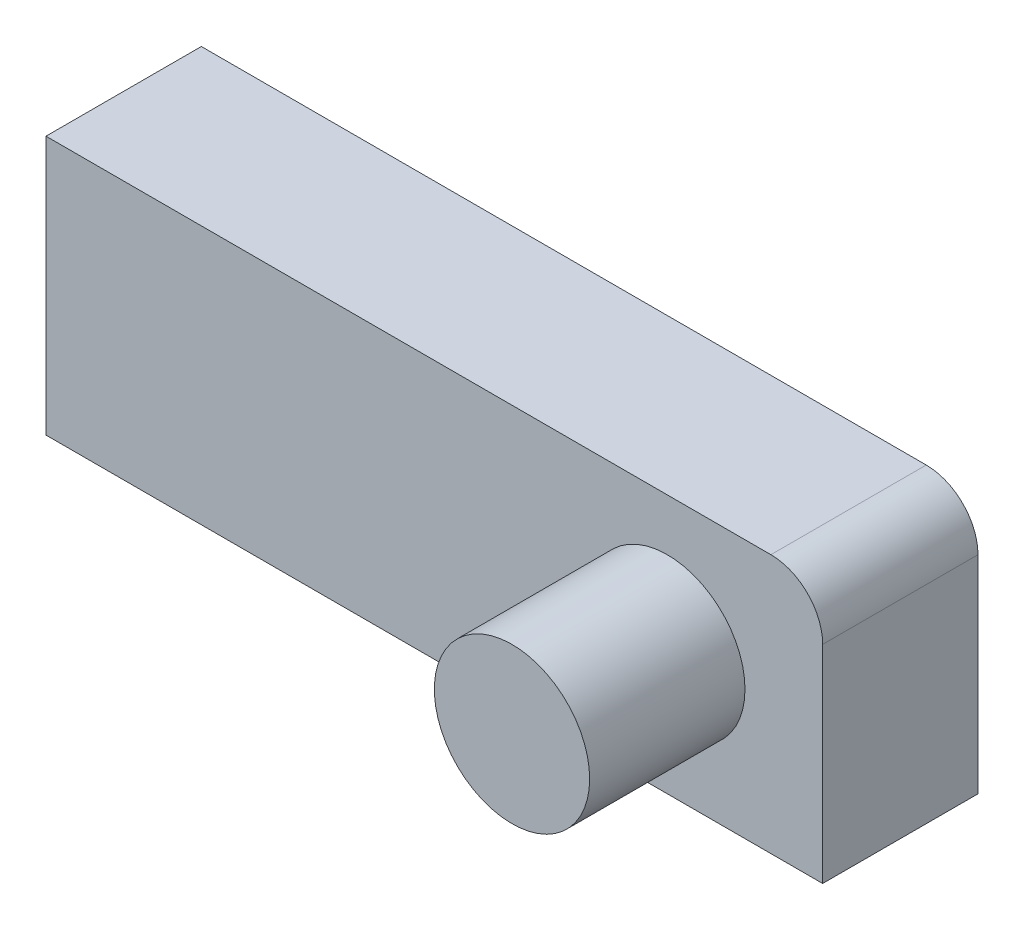
ISO-10303-21;
HEADER;
FILE_DESCRIPTION(('STEP AP214'),'2;1');
FILE_NAME('part.step','',(''),(''),'','','');
FILE_SCHEMA(('AUTOMOTIVE_DESIGN { 1 0 10303 214 1 1 1 1 }'));
ENDSEC;
DATA;
#1=APPLICATION_CONTEXT('core data for automotive mechanical design processes');
#2=APPLICATION_PROTOCOL_DEFINITION('international standard','automotive_design',2000,#1);
#3=PRODUCT_CONTEXT('',#1,'mechanical');
#4=PRODUCT('Part','Part','',(#3));
#5=PRODUCT_RELATED_PRODUCT_CATEGORY('part','',(#4));
#6=PRODUCT_DEFINITION_FORMATION('','',#4);
#7=PRODUCT_DEFINITION_CONTEXT('part definition',#1,'design');
#8=PRODUCT_DEFINITION('design','',#6,#7);
#9=PRODUCT_DEFINITION_SHAPE('','',#8);
#10=(LENGTH_UNIT() NAMED_UNIT(*) SI_UNIT(.MILLI.,.METRE.));
#11=(NAMED_UNIT(*) PLANE_ANGLE_UNIT() SI_UNIT($,.RADIAN.));
#12=(NAMED_UNIT(*) SI_UNIT($,.STERADIAN.) SOLID_ANGLE_UNIT());
#13=UNCERTAINTY_MEASURE_WITH_UNIT(LENGTH_MEASURE(1.E-05),#10,'distance_accuracy_value','');
#14=(GEOMETRIC_REPRESENTATION_CONTEXT(3) GLOBAL_UNCERTAINTY_ASSIGNED_CONTEXT((#13)) GLOBAL_UNIT_ASSIGNED_CONTEXT((#10,
#11,#12)) REPRESENTATION_CONTEXT('',''));
#15=CARTESIAN_POINT('',(0.,0.,0.));
#16=DIRECTION('',(0.,0.,1.));
#17=DIRECTION('',(1.,0.,0.));
#18=AXIS2_PLACEMENT_3D('',#15,#16,#17);
#19=CARTESIAN_POINT('',(-1.77570093457944,4.24065420560748,3.));
#20=DIRECTION('',(-1.,0.,0.));
#21=DIRECTION('',(0.,-1.,0.));
#22=AXIS2_PLACEMENT_3D('',#19,#20,#21);
#23=PLANE('',#22);
#24=DIRECTION('',(0.,1.,0.));
#25=VECTOR('',#24,1.);
#26=CARTESIAN_POINT('',(-1.77570093457944,4.24065420560748,0.));
#27=LINE('',#26,#25);
#28=CARTESIAN_POINT('',(-1.77570093457944,-0.759345794392522,0.));
#29=VERTEX_POINT('',#28);
#30=CARTESIAN_POINT('',(-1.77570093457944,3.24065420560748,0.));
#31=VERTEX_POINT('',#30);
#32=EDGE_CURVE('E113',#29,#31,#27,.T.);
#33=ORIENTED_EDGE('',*,*,#32,.T.);
#34=DIRECTION('',(0.,0.,-1.));
#35=VECTOR('',#34,1.);
#36=CARTESIAN_POINT('',(-1.77570093457944,3.24065420560748,3.));
#37=LINE('',#36,#35);
#38=CARTESIAN_POINT('',(-1.77570093457944,3.24065420560748,3.));
#39=VERTEX_POINT('',#38);
#40=EDGE_CURVE('E45',#31,#39,#37,.F.);
#41=ORIENTED_EDGE('',*,*,#40,.T.);
#42=DIRECTION('',(0.,1.,0.));
#43=VECTOR('',#42,1.);
#44=CARTESIAN_POINT('',(-1.77570093457944,4.24065420560748,3.));
#45=LINE('',#44,#43);
#46=CARTESIAN_POINT('',(-1.77570093457944,-0.759345794392522,3.));
#47=VERTEX_POINT('',#46);
#48=EDGE_CURVE('E93',#47,#39,#45,.T.);
#49=ORIENTED_EDGE('',*,*,#48,.F.);
#50=DIRECTION('',(0.,0.,-1.));
#51=VECTOR('',#50,1.);
#52=CARTESIAN_POINT('',(-1.77570093457944,-0.759345794392522,3.));
#53=LINE('',#52,#51);
#54=EDGE_CURVE('E109',#47,#29,#53,.T.);
#55=ORIENTED_EDGE('',*,*,#54,.T.);
#56=EDGE_LOOP('',(#33,#41,#49,#55));
#57=FACE_BOUND('',#56,.T.);
#58=ADVANCED_FACE('F37',(#57),#23,.F.);
#59=CARTESIAN_POINT('',(-16.7757009345794,4.24065420560748,3.));
#60=DIRECTION('',(0.,-1.,0.));
#61=DIRECTION('',(0.,0.,-1.));
#62=AXIS2_PLACEMENT_3D('',#59,#60,#61);
#63=PLANE('',#62);
#64=DIRECTION('',(-1.,0.,0.));
#65=VECTOR('',#64,1.);
#66=CARTESIAN_POINT('',(-16.7757009345794,4.24065420560748,3.));
#67=LINE('',#66,#65);
#68=CARTESIAN_POINT('',(-2.77570093457944,4.24065420560748,3.));
#69=VERTEX_POINT('',#68);
#70=CARTESIAN_POINT('',(-16.7757009345794,4.24065420560748,3.));
#71=VERTEX_POINT('',#70);
#72=EDGE_CURVE('E83',#69,#71,#67,.T.);
#73=ORIENTED_EDGE('',*,*,#72,.F.);
#74=DIRECTION('',(0.,0.,-1.));
#75=VECTOR('',#74,1.);
#76=CARTESIAN_POINT('',(-2.77570093457944,4.24065420560748,3.));
#77=LINE('',#76,#75);
#78=CARTESIAN_POINT('',(-2.77570093457944,4.24065420560748,0.));
#79=VERTEX_POINT('',#78);
#80=EDGE_CURVE('E101',#69,#79,#77,.T.);
#81=ORIENTED_EDGE('',*,*,#80,.T.);
#82=DIRECTION('',(-1.,0.,0.));
#83=VECTOR('',#82,1.);
#84=CARTESIAN_POINT('',(-16.7757009345794,4.24065420560748,0.));
#85=LINE('',#84,#83);
#86=CARTESIAN_POINT('',(-16.7757009345794,4.24065420560748,0.));
#87=VERTEX_POINT('',#86);
#88=EDGE_CURVE('E98',#79,#87,#85,.T.);
#89=ORIENTED_EDGE('',*,*,#88,.T.);
#90=DIRECTION('',(0.,0.,-1.));
#91=VECTOR('',#90,1.);
#92=CARTESIAN_POINT('',(-16.7757009345794,4.24065420560748,3.));
#93=LINE('',#92,#91);
#94=EDGE_CURVE('E96',#71,#87,#93,.T.);
#95=ORIENTED_EDGE('',*,*,#94,.F.);
#96=EDGE_LOOP('',(#73,#81,#89,#95));
#97=FACE_BOUND('',#96,.T.);
#98=ADVANCED_FACE('F97',(#97),#63,.F.);
#99=CARTESIAN_POINT('',(-16.7757009345794,4.24065420560748,3.));
#100=DIRECTION('',(1.,0.,0.));
#101=DIRECTION('',(0.,0.,-1.));
#102=AXIS2_PLACEMENT_3D('',#99,#100,#101);
#103=PLANE('',#102);
#104=DIRECTION('',(0.,-1.,0.));
#105=VECTOR('',#104,1.);
#106=CARTESIAN_POINT('',(-16.7757009345794,4.24065420560748,0.));
#107=LINE('',#106,#105);
#108=CARTESIAN_POINT('',(-16.7757009345794,-0.759345794392522,0.));
#109=VERTEX_POINT('',#108);
#110=EDGE_CURVE('E117',#87,#109,#107,.T.);
#111=ORIENTED_EDGE('',*,*,#110,.T.);
#112=DIRECTION('',(0.,0.,-1.));
#113=VECTOR('',#112,1.);
#114=CARTESIAN_POINT('',(-16.7757009345794,-0.759345794392522,3.));
#115=LINE('',#114,#113);
#116=CARTESIAN_POINT('',(-16.7757009345794,-0.759345794392522,3.));
#117=VERTEX_POINT('',#116);
#118=EDGE_CURVE('E102',#117,#109,#115,.T.);
#119=ORIENTED_EDGE('',*,*,#118,.F.);
#120=DIRECTION('',(0.,-1.,0.));
#121=VECTOR('',#120,1.);
#122=CARTESIAN_POINT('',(-16.7757009345794,4.24065420560748,3.));
#123=LINE('',#122,#121);
#124=EDGE_CURVE('E87',#71,#117,#123,.T.);
#125=ORIENTED_EDGE('',*,*,#124,.F.);
#126=ORIENTED_EDGE('',*,*,#94,.T.);
#127=EDGE_LOOP('',(#111,#119,#125,#126));
#128=FACE_BOUND('',#127,.T.);
#129=ADVANCED_FACE('F104',(#128),#103,.F.);
#130=CARTESIAN_POINT('',(-16.7757009345794,-0.759345794392522,3.));
#131=DIRECTION('',(0.,1.,0.));
#132=DIRECTION('',(0.,0.,1.));
#133=AXIS2_PLACEMENT_3D('',#130,#131,#132);
#134=PLANE('',#133);
#135=DIRECTION('',(1.,0.,0.));
#136=VECTOR('',#135,1.);
#137=CARTESIAN_POINT('',(-16.7757009345794,-0.759345794392522,0.));
#138=LINE('',#137,#136);
#139=EDGE_CURVE('E119',#109,#29,#138,.T.);
#140=ORIENTED_EDGE('',*,*,#139,.T.);
#141=ORIENTED_EDGE('',*,*,#54,.F.);
#142=DIRECTION('',(1.,0.,0.));
#143=VECTOR('',#142,1.);
#144=CARTESIAN_POINT('',(-16.7757009345794,-0.759345794392522,3.));
#145=LINE('',#144,#143);
#146=EDGE_CURVE('E107',#117,#47,#145,.T.);
#147=ORIENTED_EDGE('',*,*,#146,.F.);
#148=ORIENTED_EDGE('',*,*,#118,.T.);
#149=EDGE_LOOP('',(#140,#141,#147,#148));
#150=FACE_BOUND('',#149,.T.);
#151=ADVANCED_FACE('F129',(#150),#134,.F.);
#152=CARTESIAN_POINT('',(0.,0.,3.));
#153=DIRECTION('',(0.,0.,1.));
#154=DIRECTION('',(1.,0.,0.));
#155=AXIS2_PLACEMENT_3D('',#152,#153,#154);
#156=PLANE('',#155);
#157=CARTESIAN_POINT('',(-4.77570093457944,1.74065420560748,3.));
#158=DIRECTION('',(0.,0.,1.));
#159=DIRECTION('',(1.,0.,0.));
#160=AXIS2_PLACEMENT_3D('',#157,#158,#159);
#161=CIRCLE('',#160,1.5);
#162=CARTESIAN_POINT('',(-3.27570093457944,1.74065420560748,3.));
#163=VERTEX_POINT('',#162);
#164=EDGE_CURVE('E163',#163,#163,#161,.T.);
#165=ORIENTED_EDGE('',*,*,#164,.F.);
#166=EDGE_LOOP('',(#165));
#167=FACE_BOUND('',#166,.T.);
#168=ORIENTED_EDGE('',*,*,#48,.T.);
#169=CARTESIAN_POINT('',(-2.77570093457944,3.24065420560748,3.));
#170=DIRECTION('',(0.,0.,1.));
#171=DIRECTION('',(1.,0.,0.));
#172=AXIS2_PLACEMENT_3D('',#169,#170,#171);
#173=CIRCLE('',#172,1.);
#174=EDGE_CURVE('E11',#39,#69,#173,.T.);
#175=ORIENTED_EDGE('',*,*,#174,.T.);
#176=ORIENTED_EDGE('',*,*,#72,.T.);
#177=ORIENTED_EDGE('',*,*,#124,.T.);
#178=ORIENTED_EDGE('',*,*,#146,.T.);
#179=EDGE_LOOP('',(#168,#175,#176,#177,#178));
#180=FACE_BOUND('',#179,.T.);
#181=ADVANCED_FACE('F85',(#167,#180),#156,.T.);
#182=CARTESIAN_POINT('',(0.,0.,0.));
#183=DIRECTION('',(0.,0.,1.));
#184=DIRECTION('',(1.,0.,0.));
#185=AXIS2_PLACEMENT_3D('',#182,#183,#184);
#186=PLANE('',#185);
#187=ORIENTED_EDGE('',*,*,#88,.F.);
#188=CARTESIAN_POINT('',(-2.77570093457944,3.24065420560748,0.));
#189=DIRECTION('',(0.,0.,1.));
#190=DIRECTION('',(1.,0.,0.));
#191=AXIS2_PLACEMENT_3D('',#188,#189,#190);
#192=CIRCLE('',#191,1.);
#193=EDGE_CURVE('E59',#79,#31,#192,.F.);
#194=ORIENTED_EDGE('',*,*,#193,.T.);
#195=ORIENTED_EDGE('',*,*,#32,.F.);
#196=ORIENTED_EDGE('',*,*,#139,.F.);
#197=ORIENTED_EDGE('',*,*,#110,.F.);
#198=EDGE_LOOP('',(#187,#194,#195,#196,#197));
#199=FACE_BOUND('',#198,.T.);
#200=ADVANCED_FACE('F126',(#199),#186,.F.);
#201=CARTESIAN_POINT('',(-4.77570093457944,1.74065420560748,6.));
#202=DIRECTION('',(0.,0.,-1.));
#203=DIRECTION('',(-1.,0.,0.));
#204=AXIS2_PLACEMENT_3D('',#201,#202,#203);
#205=CYLINDRICAL_SURFACE('',#204,1.5);
#206=CARTESIAN_POINT('',(-4.77570093457944,1.74065420560748,6.));
#207=DIRECTION('',(0.,0.,1.));
#208=DIRECTION('',(1.,0.,0.));
#209=AXIS2_PLACEMENT_3D('',#206,#207,#208);
#210=CIRCLE('',#209,1.5);
#211=CARTESIAN_POINT('',(-3.27570093457944,1.74065420560748,6.));
#212=VERTEX_POINT('',#211);
#213=EDGE_CURVE('E115',#212,#212,#210,.T.);
#214=ORIENTED_EDGE('',*,*,#213,.F.);
#215=EDGE_LOOP('',(#214));
#216=FACE_BOUND('',#215,.T.);
#217=ORIENTED_EDGE('',*,*,#164,.T.);
#218=EDGE_LOOP('',(#217));
#219=FACE_BOUND('',#218,.T.);
#220=ADVANCED_FACE('F136',(#216,#219),#205,.T.);
#221=CARTESIAN_POINT('',(-4.77570093457944,1.74065420560748,6.));
#222=DIRECTION('',(0.,0.,1.));
#223=DIRECTION('',(1.,0.,0.));
#224=AXIS2_PLACEMENT_3D('',#221,#222,#223);
#225=PLANE('',#224);
#226=ORIENTED_EDGE('',*,*,#213,.T.);
#227=EDGE_LOOP('',(#226));
#228=FACE_BOUND('',#227,.T.);
#229=ADVANCED_FACE('F132',(#228),#225,.T.);
#230=CARTESIAN_POINT('',(-2.77570093457944,3.24065420560748,3.));
#231=DIRECTION('',(0.,0.,-1.));
#232=DIRECTION('',(-1.,0.,0.));
#233=AXIS2_PLACEMENT_3D('',#230,#231,#232);
#234=CYLINDRICAL_SURFACE('',#233,1.);
#235=ORIENTED_EDGE('',*,*,#174,.F.);
#236=ORIENTED_EDGE('',*,*,#40,.F.);
#237=ORIENTED_EDGE('',*,*,#193,.F.);
#238=ORIENTED_EDGE('',*,*,#80,.F.);
#239=EDGE_LOOP('',(#235,#236,#237,#238));
#240=FACE_BOUND('',#239,.T.);
#241=ADVANCED_FACE('F39',(#240),#234,.T.);
#242=CLOSED_SHELL('',(#58,#98,#129,#151,#181,#200,#220,#229,#241));
#243=MANIFOLD_SOLID_BREP('B2',#242);
#244=ADVANCED_BREP_SHAPE_REPRESENTATION('',(#18,#243),#14);
#245=SHAPE_DEFINITION_REPRESENTATION(#9,#244);
ENDSEC;
END-ISO-10303-21;
